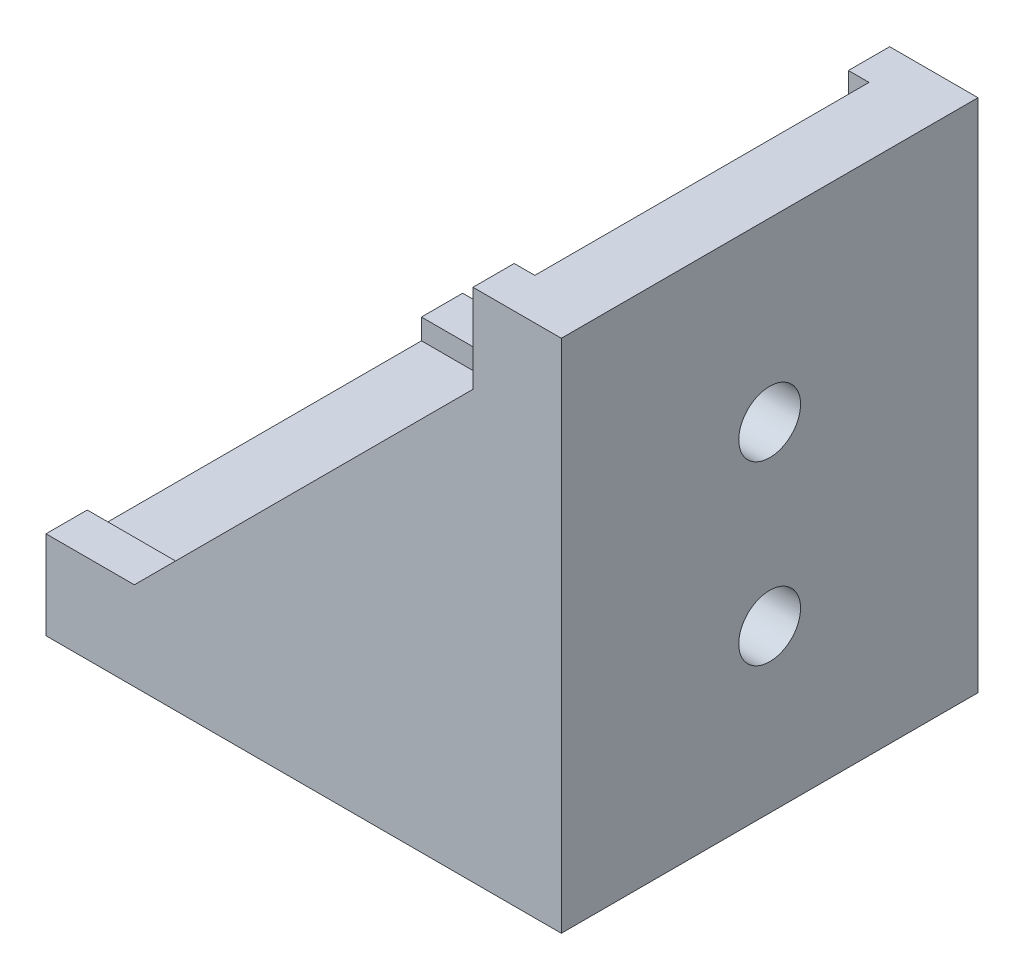
ISO-10303-21;
HEADER;
FILE_DESCRIPTION(('STEP AP214'),'2;1');
FILE_NAME('part.step','',(''),(''),'','','');
FILE_SCHEMA(('AUTOMOTIVE_DESIGN { 1 0 10303 214 1 1 1 1 }'));
ENDSEC;
DATA;
#1=APPLICATION_CONTEXT('core data for automotive mechanical design processes');
#2=APPLICATION_PROTOCOL_DEFINITION('international standard','automotive_design',2000,#1);
#3=PRODUCT_CONTEXT('',#1,'mechanical');
#4=PRODUCT('Part','Part','',(#3));
#5=PRODUCT_RELATED_PRODUCT_CATEGORY('part','',(#4));
#6=PRODUCT_DEFINITION_FORMATION('','',#4);
#7=PRODUCT_DEFINITION_CONTEXT('part definition',#1,'design');
#8=PRODUCT_DEFINITION('design','',#6,#7);
#9=PRODUCT_DEFINITION_SHAPE('','',#8);
#10=(LENGTH_UNIT() NAMED_UNIT(*) SI_UNIT(.MILLI.,.METRE.));
#11=(NAMED_UNIT(*) PLANE_ANGLE_UNIT() SI_UNIT($,.RADIAN.));
#12=(NAMED_UNIT(*) SI_UNIT($,.STERADIAN.) SOLID_ANGLE_UNIT());
#13=UNCERTAINTY_MEASURE_WITH_UNIT(LENGTH_MEASURE(1.E-05),#10,'distance_accuracy_value','');
#14=(GEOMETRIC_REPRESENTATION_CONTEXT(3) GLOBAL_UNCERTAINTY_ASSIGNED_CONTEXT((#13)) GLOBAL_UNIT_ASSIGNED_CONTEXT((#10,
#11,#12)) REPRESENTATION_CONTEXT('',''));
#15=CARTESIAN_POINT('',(0.,0.,0.));
#16=DIRECTION('',(0.,0.,1.));
#17=DIRECTION('',(1.,0.,0.));
#18=AXIS2_PLACEMENT_3D('',#15,#16,#17);
#19=CARTESIAN_POINT('',(29.,35.,14.15));
#20=DIRECTION('',(1.,0.,0.));
#21=DIRECTION('',(0.,0.,-1.));
#22=AXIS2_PLACEMENT_3D('',#19,#20,#21);
#23=PLANE('',#22);
#24=DIRECTION('',(0.,-1.,0.));
#25=VECTOR('',#24,1.);
#26=CARTESIAN_POINT('',(29.,35.,-11.35));
#27=LINE('',#26,#25);
#28=CARTESIAN_POINT('',(29.,35.,-11.35));
#29=VERTEX_POINT('',#28);
#30=CARTESIAN_POINT('',(29.,29.,-11.35));
#31=VERTEX_POINT('',#30);
#32=EDGE_CURVE('E222',#29,#31,#27,.T.);
#33=ORIENTED_EDGE('',*,*,#32,.F.);
#34=DIRECTION('',(0.,0.,-1.));
#35=VECTOR('',#34,1.);
#36=CARTESIAN_POINT('',(29.,35.,14.15));
#37=LINE('',#36,#35);
#38=CARTESIAN_POINT('',(29.,35.,-14.15));
#39=VERTEX_POINT('',#38);
#40=EDGE_CURVE('E131',#29,#39,#37,.T.);
#41=ORIENTED_EDGE('',*,*,#40,.T.);
#42=DIRECTION('',(0.,-1.,0.));
#43=VECTOR('',#42,1.);
#44=CARTESIAN_POINT('',(29.,35.,-14.15));
#45=LINE('',#44,#43);
#46=CARTESIAN_POINT('',(29.,29.,-14.15));
#47=VERTEX_POINT('',#46);
#48=EDGE_CURVE('E150',#39,#47,#45,.T.);
#49=ORIENTED_EDGE('',*,*,#48,.T.);
#50=DIRECTION('',(0.,0.,-1.));
#51=VECTOR('',#50,1.);
#52=CARTESIAN_POINT('',(29.,29.,14.15));
#53=LINE('',#52,#51);
#54=EDGE_CURVE('E132',#31,#47,#53,.T.);
#55=ORIENTED_EDGE('',*,*,#54,.F.);
#56=EDGE_LOOP('',(#33,#41,#49,#55));
#57=FACE_BOUND('',#56,.T.);
#58=ADVANCED_FACE('F35',(#57),#23,.F.);
#59=CARTESIAN_POINT('',(29.,29.,14.15));
#60=DIRECTION('',(0.707106781186547,-0.707106781186547,0.));
#61=DIRECTION('',(0.707106781186548,0.707106781186548,0.));
#62=AXIS2_PLACEMENT_3D('',#59,#60,#61);
#63=PLANE('',#62);
#64=DIRECTION('',(-0.707106781186548,-0.707106781186548,0.));
#65=VECTOR('',#64,1.);
#66=CARTESIAN_POINT('',(29.,29.,-11.35));
#67=LINE('',#66,#65);
#68=CARTESIAN_POINT('',(6.,6.,-11.35));
#69=VERTEX_POINT('',#68);
#70=EDGE_CURVE('E50',#31,#69,#67,.T.);
#71=ORIENTED_EDGE('',*,*,#70,.F.);
#72=ORIENTED_EDGE('',*,*,#54,.T.);
#73=DIRECTION('',(-0.707106781186548,-0.707106781186548,0.));
#74=VECTOR('',#73,1.);
#75=CARTESIAN_POINT('',(29.,29.,-14.15));
#76=LINE('',#75,#74);
#77=CARTESIAN_POINT('',(6.,6.,-14.15));
#78=VERTEX_POINT('',#77);
#79=EDGE_CURVE('E153',#47,#78,#76,.T.);
#80=ORIENTED_EDGE('',*,*,#79,.T.);
#81=DIRECTION('',(0.,0.,-1.));
#82=VECTOR('',#81,1.);
#83=CARTESIAN_POINT('',(6.,6.,14.15));
#84=LINE('',#83,#82);
#85=EDGE_CURVE('E162',#69,#78,#84,.T.);
#86=ORIENTED_EDGE('',*,*,#85,.F.);
#87=EDGE_LOOP('',(#71,#72,#80,#86));
#88=FACE_BOUND('',#87,.T.);
#89=ADVANCED_FACE('F327',(#88),#63,.F.);
#90=CARTESIAN_POINT('',(6.,6.,14.15));
#91=DIRECTION('',(0.,-1.,0.));
#92=DIRECTION('',(1.,0.,0.));
#93=AXIS2_PLACEMENT_3D('',#90,#91,#92);
#94=PLANE('',#93);
#95=DIRECTION('',(-1.,0.,0.));
#96=VECTOR('',#95,1.);
#97=CARTESIAN_POINT('',(6.,6.,-11.35));
#98=LINE('',#97,#96);
#99=CARTESIAN_POINT('',(0.,6.,-11.35));
#100=VERTEX_POINT('',#99);
#101=EDGE_CURVE('E43',#69,#100,#98,.T.);
#102=ORIENTED_EDGE('',*,*,#101,.F.);
#103=ORIENTED_EDGE('',*,*,#85,.T.);
#104=DIRECTION('',(-1.,0.,0.));
#105=VECTOR('',#104,1.);
#106=CARTESIAN_POINT('',(6.,6.,-14.15));
#107=LINE('',#106,#105);
#108=CARTESIAN_POINT('',(0.,6.,-14.15));
#109=VERTEX_POINT('',#108);
#110=EDGE_CURVE('E156',#78,#109,#107,.T.);
#111=ORIENTED_EDGE('',*,*,#110,.T.);
#112=DIRECTION('',(0.,0.,-1.));
#113=VECTOR('',#112,1.);
#114=CARTESIAN_POINT('',(0.,6.,14.15));
#115=LINE('',#114,#113);
#116=EDGE_CURVE('E90',#100,#109,#115,.T.);
#117=ORIENTED_EDGE('',*,*,#116,.F.);
#118=EDGE_LOOP('',(#102,#103,#111,#117));
#119=FACE_BOUND('',#118,.T.);
#120=ADVANCED_FACE('F192',(#119),#94,.F.);
#121=CARTESIAN_POINT('',(0.,6.,14.15));
#122=DIRECTION('',(1.,0.,0.));
#123=DIRECTION('',(0.,1.,0.));
#124=AXIS2_PLACEMENT_3D('',#121,#122,#123);
#125=PLANE('',#124);
#126=CARTESIAN_POINT('',(0.,6.,14.15));
#127=VERTEX_POINT('',#126);
#128=CARTESIAN_POINT('',(0.,6.,11.35));
#129=VERTEX_POINT('',#128);
#130=EDGE_CURVE('E159',#127,#129,#115,.T.);
#131=ORIENTED_EDGE('',*,*,#130,.T.);
#132=DIRECTION('',(0.,-1.,0.));
#133=VECTOR('',#132,1.);
#134=CARTESIAN_POINT('',(0.,35.,11.35));
#135=LINE('',#134,#133);
#136=CARTESIAN_POINT('',(0.,4.59999999999999,11.35));
#137=VERTEX_POINT('',#136);
#138=EDGE_CURVE('E236',#129,#137,#135,.T.);
#139=ORIENTED_EDGE('',*,*,#138,.T.);
#140=DIRECTION('',(0.,0.,-1.));
#141=VECTOR('',#140,1.);
#142=CARTESIAN_POINT('',(0.,4.59999999999999,11.35));
#143=LINE('',#142,#141);
#144=CARTESIAN_POINT('',(0.,4.59999999999999,-11.35));
#145=VERTEX_POINT('',#144);
#146=EDGE_CURVE('E188',#137,#145,#143,.T.);
#147=ORIENTED_EDGE('',*,*,#146,.T.);
#148=DIRECTION('',(0.,-1.,0.));
#149=VECTOR('',#148,1.);
#150=CARTESIAN_POINT('',(0.,35.,-11.35));
#151=LINE('',#150,#149);
#152=EDGE_CURVE('E178',#100,#145,#151,.T.);
#153=ORIENTED_EDGE('',*,*,#152,.F.);
#154=ORIENTED_EDGE('',*,*,#116,.T.);
#155=DIRECTION('',(0.,-1.,0.));
#156=VECTOR('',#155,1.);
#157=CARTESIAN_POINT('',(0.,6.,-14.15));
#158=LINE('',#157,#156);
#159=CARTESIAN_POINT('',(0.,0.,-14.15));
#160=VERTEX_POINT('',#159);
#161=EDGE_CURVE('E141',#109,#160,#158,.T.);
#162=ORIENTED_EDGE('',*,*,#161,.T.);
#163=DIRECTION('',(0.,0.,-1.));
#164=VECTOR('',#163,1.);
#165=CARTESIAN_POINT('',(0.,0.,14.15));
#166=LINE('',#165,#164);
#167=CARTESIAN_POINT('',(0.,0.,14.15));
#168=VERTEX_POINT('',#167);
#169=EDGE_CURVE('E172',#168,#160,#166,.T.);
#170=ORIENTED_EDGE('',*,*,#169,.F.);
#171=DIRECTION('',(0.,-1.,0.));
#172=VECTOR('',#171,1.);
#173=CARTESIAN_POINT('',(0.,6.,14.15));
#174=LINE('',#173,#172);
#175=EDGE_CURVE('E158',#127,#168,#174,.T.);
#176=ORIENTED_EDGE('',*,*,#175,.F.);
#177=EDGE_LOOP('',(#131,#139,#147,#153,#154,#162,#170,#176));
#178=FACE_BOUND('',#177,.T.);
#179=ADVANCED_FACE('F37',(#178),#125,.F.);
#180=CARTESIAN_POINT('',(0.,0.,14.15));
#181=DIRECTION('',(0.,1.,0.));
#182=DIRECTION('',(0.,0.,1.));
#183=AXIS2_PLACEMENT_3D('',#180,#181,#182);
#184=PLANE('',#183);
#185=CARTESIAN_POINT('',(20.85,0.,0.));
#186=DIRECTION('',(0.,1.,0.));
#187=DIRECTION('',(0.,0.,1.));
#188=AXIS2_PLACEMENT_3D('',#185,#186,#187);
#189=CIRCLE('',#188,2.55);
#190=CARTESIAN_POINT('',(20.85,0.,2.55));
#191=VERTEX_POINT('',#190);
#192=EDGE_CURVE('E252',#191,#191,#189,.T.);
#193=ORIENTED_EDGE('',*,*,#192,.T.);
#194=EDGE_LOOP('',(#193));
#195=FACE_BOUND('',#194,.T.);
#196=CARTESIAN_POINT('',(11.,0.,0.));
#197=DIRECTION('',(0.,1.,0.));
#198=DIRECTION('',(0.,0.,1.));
#199=AXIS2_PLACEMENT_3D('',#196,#197,#198);
#200=CIRCLE('',#199,2.55);
#201=CARTESIAN_POINT('',(11.,0.,2.55));
#202=VERTEX_POINT('',#201);
#203=EDGE_CURVE('E253',#202,#202,#200,.T.);
#204=ORIENTED_EDGE('',*,*,#203,.T.);
#205=EDGE_LOOP('',(#204));
#206=FACE_BOUND('',#205,.T.);
#207=DIRECTION('',(1.,0.,0.));
#208=VECTOR('',#207,1.);
#209=CARTESIAN_POINT('',(0.,0.,-14.15));
#210=LINE('',#209,#208);
#211=CARTESIAN_POINT('',(35.,0.,-14.15));
#212=VERTEX_POINT('',#211);
#213=EDGE_CURVE('E143',#160,#212,#210,.T.);
#214=ORIENTED_EDGE('',*,*,#213,.T.);
#215=DIRECTION('',(0.,0.,-1.));
#216=VECTOR('',#215,1.);
#217=CARTESIAN_POINT('',(35.,0.,14.15));
#218=LINE('',#217,#216);
#219=CARTESIAN_POINT('',(35.,0.,14.15));
#220=VERTEX_POINT('',#219);
#221=EDGE_CURVE('E169',#220,#212,#218,.T.);
#222=ORIENTED_EDGE('',*,*,#221,.F.);
#223=DIRECTION('',(1.,0.,0.));
#224=VECTOR('',#223,1.);
#225=CARTESIAN_POINT('',(0.,0.,14.15));
#226=LINE('',#225,#224);
#227=EDGE_CURVE('E99',#168,#220,#226,.T.);
#228=ORIENTED_EDGE('',*,*,#227,.F.);
#229=ORIENTED_EDGE('',*,*,#169,.T.);
#230=EDGE_LOOP('',(#214,#222,#228,#229));
#231=FACE_BOUND('',#230,.T.);
#232=ADVANCED_FACE('F201',(#195,#206,#231),#184,.F.);
#233=CARTESIAN_POINT('',(35.,0.,14.15));
#234=DIRECTION('',(-1.,0.,0.));
#235=DIRECTION('',(0.,0.,1.));
#236=AXIS2_PLACEMENT_3D('',#233,#234,#235);
#237=PLANE('',#236);
#238=CARTESIAN_POINT('',(35.,23.,0.));
#239=DIRECTION('',(-1.,0.,0.));
#240=DIRECTION('',(0.,0.,1.));
#241=AXIS2_PLACEMENT_3D('',#238,#239,#240);
#242=CIRCLE('',#241,2.1);
#243=CARTESIAN_POINT('',(35.,23.,2.1));
#244=VERTEX_POINT('',#243);
#245=EDGE_CURVE('E267',#244,#244,#242,.T.);
#246=ORIENTED_EDGE('',*,*,#245,.T.);
#247=EDGE_LOOP('',(#246));
#248=FACE_BOUND('',#247,.T.);
#249=CARTESIAN_POINT('',(35.,11.,0.));
#250=DIRECTION('',(-1.,0.,0.));
#251=DIRECTION('',(0.,0.,1.));
#252=AXIS2_PLACEMENT_3D('',#249,#250,#251);
#253=CIRCLE('',#252,2.1);
#254=CARTESIAN_POINT('',(35.,11.,2.1));
#255=VERTEX_POINT('',#254);
#256=EDGE_CURVE('E261',#255,#255,#253,.T.);
#257=ORIENTED_EDGE('',*,*,#256,.T.);
#258=EDGE_LOOP('',(#257));
#259=FACE_BOUND('',#258,.T.);
#260=DIRECTION('',(0.,1.,0.));
#261=VECTOR('',#260,1.);
#262=CARTESIAN_POINT('',(35.,0.,-14.15));
#263=LINE('',#262,#261);
#264=CARTESIAN_POINT('',(35.,35.,-14.15));
#265=VERTEX_POINT('',#264);
#266=EDGE_CURVE('E145',#212,#265,#263,.T.);
#267=ORIENTED_EDGE('',*,*,#266,.T.);
#268=DIRECTION('',(0.,0.,-1.));
#269=VECTOR('',#268,1.);
#270=CARTESIAN_POINT('',(35.,35.,14.15));
#271=LINE('',#270,#269);
#272=CARTESIAN_POINT('',(35.,35.,14.15));
#273=VERTEX_POINT('',#272);
#274=EDGE_CURVE('E166',#273,#265,#271,.T.);
#275=ORIENTED_EDGE('',*,*,#274,.F.);
#276=DIRECTION('',(0.,1.,0.));
#277=VECTOR('',#276,1.);
#278=CARTESIAN_POINT('',(35.,0.,14.15));
#279=LINE('',#278,#277);
#280=EDGE_CURVE('E206',#220,#273,#279,.T.);
#281=ORIENTED_EDGE('',*,*,#280,.F.);
#282=ORIENTED_EDGE('',*,*,#221,.T.);
#283=EDGE_LOOP('',(#267,#275,#281,#282));
#284=FACE_BOUND('',#283,.T.);
#285=ADVANCED_FACE('F204',(#248,#259,#284),#237,.F.);
#286=CARTESIAN_POINT('',(35.,35.,14.15));
#287=DIRECTION('',(0.,-1.,0.));
#288=DIRECTION('',(0.,0.,-1.));
#289=AXIS2_PLACEMENT_3D('',#286,#287,#288);
#290=PLANE('',#289);
#291=DIRECTION('',(0.,0.,-1.));
#292=VECTOR('',#291,1.);
#293=CARTESIAN_POINT('',(30.4,35.,11.35));
#294=LINE('',#293,#292);
#295=CARTESIAN_POINT('',(30.4,35.,11.35));
#296=VERTEX_POINT('',#295);
#297=CARTESIAN_POINT('',(30.4,35.,-11.35));
#298=VERTEX_POINT('',#297);
#299=EDGE_CURVE('E229',#296,#298,#294,.T.);
#300=ORIENTED_EDGE('',*,*,#299,.F.);
#301=DIRECTION('',(-1.,0.,0.));
#302=VECTOR('',#301,1.);
#303=CARTESIAN_POINT('',(30.4,35.,11.35));
#304=LINE('',#303,#302);
#305=CARTESIAN_POINT('',(29.,35.,11.35));
#306=VERTEX_POINT('',#305);
#307=EDGE_CURVE('E232',#296,#306,#304,.T.);
#308=ORIENTED_EDGE('',*,*,#307,.T.);
#309=CARTESIAN_POINT('',(29.,35.,14.15));
#310=VERTEX_POINT('',#309);
#311=EDGE_CURVE('E164',#310,#306,#37,.T.);
#312=ORIENTED_EDGE('',*,*,#311,.F.);
#313=DIRECTION('',(-1.,0.,0.));
#314=VECTOR('',#313,1.);
#315=CARTESIAN_POINT('',(35.,35.,14.15));
#316=LINE('',#315,#314);
#317=EDGE_CURVE('E118',#273,#310,#316,.T.);
#318=ORIENTED_EDGE('',*,*,#317,.F.);
#319=ORIENTED_EDGE('',*,*,#274,.T.);
#320=DIRECTION('',(-1.,0.,0.));
#321=VECTOR('',#320,1.);
#322=CARTESIAN_POINT('',(35.,35.,-14.15));
#323=LINE('',#322,#321);
#324=EDGE_CURVE('E147',#265,#39,#323,.T.);
#325=ORIENTED_EDGE('',*,*,#324,.T.);
#326=ORIENTED_EDGE('',*,*,#40,.F.);
#327=DIRECTION('',(-1.,0.,0.));
#328=VECTOR('',#327,1.);
#329=CARTESIAN_POINT('',(30.4,35.,-11.35));
#330=LINE('',#329,#328);
#331=EDGE_CURVE('E233',#298,#29,#330,.T.);
#332=ORIENTED_EDGE('',*,*,#331,.F.);
#333=EDGE_LOOP('',(#300,#308,#312,#318,#319,#325,#326,#332));
#334=FACE_BOUND('',#333,.T.);
#335=ADVANCED_FACE('F212',(#334),#290,.F.);
#336=ORIENTED_EDGE('',*,*,#311,.T.);
#337=DIRECTION('',(0.,-1.,0.));
#338=VECTOR('',#337,1.);
#339=CARTESIAN_POINT('',(29.,35.,11.35));
#340=LINE('',#339,#338);
#341=CARTESIAN_POINT('',(29.,29.,11.35));
#342=VERTEX_POINT('',#341);
#343=EDGE_CURVE('E128',#306,#342,#340,.T.);
#344=ORIENTED_EDGE('',*,*,#343,.T.);
#345=CARTESIAN_POINT('',(29.,29.,14.15));
#346=VERTEX_POINT('',#345);
#347=EDGE_CURVE('E125',#346,#342,#53,.T.);
#348=ORIENTED_EDGE('',*,*,#347,.F.);
#349=DIRECTION('',(0.,-1.,0.));
#350=VECTOR('',#349,1.);
#351=CARTESIAN_POINT('',(29.,35.,14.15));
#352=LINE('',#351,#350);
#353=EDGE_CURVE('E111',#310,#346,#352,.T.);
#354=ORIENTED_EDGE('',*,*,#353,.F.);
#355=EDGE_LOOP('',(#336,#344,#348,#354));
#356=FACE_BOUND('',#355,.T.);
#357=ADVANCED_FACE('F126',(#356),#23,.F.);
#358=ORIENTED_EDGE('',*,*,#347,.T.);
#359=DIRECTION('',(-0.707106781186548,-0.707106781186548,0.));
#360=VECTOR('',#359,1.);
#361=CARTESIAN_POINT('',(29.,29.,11.35));
#362=LINE('',#361,#360);
#363=CARTESIAN_POINT('',(6.,6.,11.35));
#364=VERTEX_POINT('',#363);
#365=EDGE_CURVE('E220',#342,#364,#362,.T.);
#366=ORIENTED_EDGE('',*,*,#365,.T.);
#367=CARTESIAN_POINT('',(6.,6.,14.15));
#368=VERTEX_POINT('',#367);
#369=EDGE_CURVE('E136',#368,#364,#84,.T.);
#370=ORIENTED_EDGE('',*,*,#369,.F.);
#371=DIRECTION('',(-0.707106781186548,-0.707106781186548,0.));
#372=VECTOR('',#371,1.);
#373=CARTESIAN_POINT('',(29.,29.,14.15));
#374=LINE('',#373,#372);
#375=EDGE_CURVE('E115',#346,#368,#374,.T.);
#376=ORIENTED_EDGE('',*,*,#375,.F.);
#377=EDGE_LOOP('',(#358,#366,#370,#376));
#378=FACE_BOUND('',#377,.T.);
#379=ADVANCED_FACE('F134',(#378),#63,.F.);
#380=ORIENTED_EDGE('',*,*,#369,.T.);
#381=DIRECTION('',(-1.,0.,0.));
#382=VECTOR('',#381,1.);
#383=CARTESIAN_POINT('',(6.,6.,11.35));
#384=LINE('',#383,#382);
#385=EDGE_CURVE('E11',#364,#129,#384,.T.);
#386=ORIENTED_EDGE('',*,*,#385,.T.);
#387=ORIENTED_EDGE('',*,*,#130,.F.);
#388=DIRECTION('',(-1.,0.,0.));
#389=VECTOR('',#388,1.);
#390=CARTESIAN_POINT('',(6.,6.,14.15));
#391=LINE('',#390,#389);
#392=EDGE_CURVE('E59',#368,#127,#391,.T.);
#393=ORIENTED_EDGE('',*,*,#392,.F.);
#394=EDGE_LOOP('',(#380,#386,#387,#393));
#395=FACE_BOUND('',#394,.T.);
#396=ADVANCED_FACE('F312',(#395),#94,.F.);
#397=CARTESIAN_POINT('',(0.,0.,14.15));
#398=DIRECTION('',(0.,0.,1.));
#399=DIRECTION('',(1.,0.,0.));
#400=AXIS2_PLACEMENT_3D('',#397,#398,#399);
#401=PLANE('',#400);
#402=ORIENTED_EDGE('',*,*,#175,.T.);
#403=ORIENTED_EDGE('',*,*,#227,.T.);
#404=ORIENTED_EDGE('',*,*,#280,.T.);
#405=ORIENTED_EDGE('',*,*,#317,.T.);
#406=ORIENTED_EDGE('',*,*,#353,.T.);
#407=ORIENTED_EDGE('',*,*,#375,.T.);
#408=ORIENTED_EDGE('',*,*,#392,.T.);
#409=EDGE_LOOP('',(#402,#403,#404,#405,#406,#407,#408));
#410=FACE_BOUND('',#409,.T.);
#411=ADVANCED_FACE('F113',(#410),#401,.T.);
#412=CARTESIAN_POINT('',(0.,0.,-14.15));
#413=DIRECTION('',(0.,0.,1.));
#414=DIRECTION('',(1.,0.,0.));
#415=AXIS2_PLACEMENT_3D('',#412,#413,#414);
#416=PLANE('',#415);
#417=ORIENTED_EDGE('',*,*,#161,.F.);
#418=ORIENTED_EDGE('',*,*,#110,.F.);
#419=ORIENTED_EDGE('',*,*,#79,.F.);
#420=ORIENTED_EDGE('',*,*,#48,.F.);
#421=ORIENTED_EDGE('',*,*,#324,.F.);
#422=ORIENTED_EDGE('',*,*,#266,.F.);
#423=ORIENTED_EDGE('',*,*,#213,.F.);
#424=EDGE_LOOP('',(#417,#418,#419,#420,#421,#422,#423));
#425=FACE_BOUND('',#424,.T.);
#426=ADVANCED_FACE('F197',(#425),#416,.F.);
#427=CARTESIAN_POINT('',(0.,0.,11.35));
#428=DIRECTION('',(0.,0.,1.));
#429=DIRECTION('',(1.,0.,0.));
#430=AXIS2_PLACEMENT_3D('',#427,#428,#429);
#431=PLANE('',#430);
#432=ORIENTED_EDGE('',*,*,#307,.F.);
#433=DIRECTION('',(0.,1.,0.));
#434=VECTOR('',#433,1.);
#435=CARTESIAN_POINT('',(30.4,4.59999999999999,11.35));
#436=LINE('',#435,#434);
#437=CARTESIAN_POINT('',(30.4,4.59999999999999,11.35));
#438=VERTEX_POINT('',#437);
#439=EDGE_CURVE('E242',#438,#296,#436,.T.);
#440=ORIENTED_EDGE('',*,*,#439,.F.);
#441=DIRECTION('',(1.,0.,0.));
#442=VECTOR('',#441,1.);
#443=CARTESIAN_POINT('',(0.,4.59999999999999,11.35));
#444=LINE('',#443,#442);
#445=EDGE_CURVE('E245',#137,#438,#444,.T.);
#446=ORIENTED_EDGE('',*,*,#445,.F.);
#447=ORIENTED_EDGE('',*,*,#138,.F.);
#448=ORIENTED_EDGE('',*,*,#385,.F.);
#449=ORIENTED_EDGE('',*,*,#365,.F.);
#450=ORIENTED_EDGE('',*,*,#343,.F.);
#451=EDGE_LOOP('',(#432,#440,#446,#447,#448,#449,#450));
#452=FACE_BOUND('',#451,.T.);
#453=ADVANCED_FACE('F310',(#452),#431,.F.);
#454=CARTESIAN_POINT('',(0.,0.,-11.35));
#455=DIRECTION('',(0.,0.,1.));
#456=DIRECTION('',(1.,0.,0.));
#457=AXIS2_PLACEMENT_3D('',#454,#455,#456);
#458=PLANE('',#457);
#459=ORIENTED_EDGE('',*,*,#32,.T.);
#460=ORIENTED_EDGE('',*,*,#70,.T.);
#461=ORIENTED_EDGE('',*,*,#101,.T.);
#462=ORIENTED_EDGE('',*,*,#152,.T.);
#463=DIRECTION('',(1.,0.,0.));
#464=VECTOR('',#463,1.);
#465=CARTESIAN_POINT('',(0.,4.59999999999999,-11.35));
#466=LINE('',#465,#464);
#467=CARTESIAN_POINT('',(30.4,4.59999999999999,-11.35));
#468=VERTEX_POINT('',#467);
#469=EDGE_CURVE('E189',#145,#468,#466,.T.);
#470=ORIENTED_EDGE('',*,*,#469,.T.);
#471=DIRECTION('',(0.,1.,0.));
#472=VECTOR('',#471,1.);
#473=CARTESIAN_POINT('',(30.4,4.59999999999999,-11.35));
#474=LINE('',#473,#472);
#475=EDGE_CURVE('E237',#468,#298,#474,.T.);
#476=ORIENTED_EDGE('',*,*,#475,.T.);
#477=ORIENTED_EDGE('',*,*,#331,.T.);
#478=EDGE_LOOP('',(#459,#460,#461,#462,#470,#476,#477));
#479=FACE_BOUND('',#478,.T.);
#480=ADVANCED_FACE('F175',(#479),#458,.T.);
#481=CARTESIAN_POINT('',(0.,4.59999999999999,11.35));
#482=DIRECTION('',(0.,1.,0.));
#483=DIRECTION('',(0.,0.,1.));
#484=AXIS2_PLACEMENT_3D('',#481,#482,#483);
#485=PLANE('',#484);
#486=CARTESIAN_POINT('',(20.85,4.59999999999999,0.));
#487=DIRECTION('',(0.,1.,0.));
#488=DIRECTION('',(0.,0.,1.));
#489=AXIS2_PLACEMENT_3D('',#486,#487,#488);
#490=CIRCLE('',#489,2.55);
#491=CARTESIAN_POINT('',(20.85,4.59999999999999,2.55));
#492=VERTEX_POINT('',#491);
#493=EDGE_CURVE('E190',#492,#492,#490,.T.);
#494=ORIENTED_EDGE('',*,*,#493,.F.);
#495=EDGE_LOOP('',(#494));
#496=FACE_BOUND('',#495,.T.);
#497=CARTESIAN_POINT('',(11.,4.59999999999999,0.));
#498=DIRECTION('',(0.,1.,0.));
#499=DIRECTION('',(0.,0.,1.));
#500=AXIS2_PLACEMENT_3D('',#497,#498,#499);
#501=CIRCLE('',#500,2.55);
#502=CARTESIAN_POINT('',(11.,4.59999999999999,2.55));
#503=VERTEX_POINT('',#502);
#504=EDGE_CURVE('E249',#503,#503,#501,.T.);
#505=ORIENTED_EDGE('',*,*,#504,.F.);
#506=EDGE_LOOP('',(#505));
#507=FACE_BOUND('',#506,.T.);
#508=ORIENTED_EDGE('',*,*,#469,.F.);
#509=ORIENTED_EDGE('',*,*,#146,.F.);
#510=ORIENTED_EDGE('',*,*,#445,.T.);
#511=DIRECTION('',(0.,0.,-1.));
#512=VECTOR('',#511,1.);
#513=CARTESIAN_POINT('',(30.4,4.59999999999999,11.35));
#514=LINE('',#513,#512);
#515=EDGE_CURVE('E226',#438,#468,#514,.T.);
#516=ORIENTED_EDGE('',*,*,#515,.T.);
#517=EDGE_LOOP('',(#508,#509,#510,#516));
#518=FACE_BOUND('',#517,.T.);
#519=ADVANCED_FACE('F280',(#496,#507,#518),#485,.T.);
#520=CARTESIAN_POINT('',(30.4,4.59999999999999,11.35));
#521=DIRECTION('',(-1.,0.,0.));
#522=DIRECTION('',(0.,0.,1.));
#523=AXIS2_PLACEMENT_3D('',#520,#521,#522);
#524=PLANE('',#523);
#525=CARTESIAN_POINT('',(30.4,23.,0.));
#526=DIRECTION('',(-1.,0.,0.));
#527=DIRECTION('',(0.,0.,1.));
#528=AXIS2_PLACEMENT_3D('',#525,#526,#527);
#529=CIRCLE('',#528,2.1);
#530=CARTESIAN_POINT('',(30.4,23.,2.1));
#531=VERTEX_POINT('',#530);
#532=EDGE_CURVE('E256',#531,#531,#529,.T.);
#533=ORIENTED_EDGE('',*,*,#532,.F.);
#534=EDGE_LOOP('',(#533));
#535=FACE_BOUND('',#534,.T.);
#536=CARTESIAN_POINT('',(30.4,11.,0.));
#537=DIRECTION('',(-1.,0.,0.));
#538=DIRECTION('',(0.,0.,1.));
#539=AXIS2_PLACEMENT_3D('',#536,#537,#538);
#540=CIRCLE('',#539,2.1);
#541=CARTESIAN_POINT('',(30.4,11.,2.1));
#542=VERTEX_POINT('',#541);
#543=EDGE_CURVE('E264',#542,#542,#540,.T.);
#544=ORIENTED_EDGE('',*,*,#543,.F.);
#545=EDGE_LOOP('',(#544));
#546=FACE_BOUND('',#545,.T.);
#547=ORIENTED_EDGE('',*,*,#475,.F.);
#548=ORIENTED_EDGE('',*,*,#515,.F.);
#549=ORIENTED_EDGE('',*,*,#439,.T.);
#550=ORIENTED_EDGE('',*,*,#299,.T.);
#551=EDGE_LOOP('',(#547,#548,#549,#550));
#552=FACE_BOUND('',#551,.T.);
#553=ADVANCED_FACE('F276',(#535,#546,#552),#524,.T.);
#554=CARTESIAN_POINT('',(11.,35.001,0.));
#555=DIRECTION('',(0.,-1.,0.));
#556=DIRECTION('',(0.,0.,-1.));
#557=AXIS2_PLACEMENT_3D('',#554,#555,#556);
#558=CYLINDRICAL_SURFACE('',#557,2.55);
#559=ORIENTED_EDGE('',*,*,#504,.T.);
#560=EDGE_LOOP('',(#559));
#561=FACE_BOUND('',#560,.T.);
#562=ORIENTED_EDGE('',*,*,#203,.F.);
#563=EDGE_LOOP('',(#562));
#564=FACE_BOUND('',#563,.T.);
#565=ADVANCED_FACE('F279',(#561,#564),#558,.F.);
#566=CARTESIAN_POINT('',(20.85,35.001,0.));
#567=DIRECTION('',(0.,-1.,0.));
#568=DIRECTION('',(0.,0.,-1.));
#569=AXIS2_PLACEMENT_3D('',#566,#567,#568);
#570=CYLINDRICAL_SURFACE('',#569,2.55);
#571=ORIENTED_EDGE('',*,*,#493,.T.);
#572=EDGE_LOOP('',(#571));
#573=FACE_BOUND('',#572,.T.);
#574=ORIENTED_EDGE('',*,*,#192,.F.);
#575=EDGE_LOOP('',(#574));
#576=FACE_BOUND('',#575,.T.);
#577=ADVANCED_FACE('F356',(#573,#576),#570,.F.);
#578=CARTESIAN_POINT('',(35.001,11.,0.));
#579=DIRECTION('',(-1.,0.,0.));
#580=DIRECTION('',(0.,0.,1.));
#581=AXIS2_PLACEMENT_3D('',#578,#579,#580);
#582=CYLINDRICAL_SURFACE('',#581,2.1);
#583=ORIENTED_EDGE('',*,*,#543,.T.);
#584=EDGE_LOOP('',(#583));
#585=FACE_BOUND('',#584,.T.);
#586=ORIENTED_EDGE('',*,*,#256,.F.);
#587=EDGE_LOOP('',(#586));
#588=FACE_BOUND('',#587,.T.);
#589=ADVANCED_FACE('F362',(#585,#588),#582,.F.);
#590=CARTESIAN_POINT('',(35.001,23.,0.));
#591=DIRECTION('',(-1.,0.,0.));
#592=DIRECTION('',(0.,0.,1.));
#593=AXIS2_PLACEMENT_3D('',#590,#591,#592);
#594=CYLINDRICAL_SURFACE('',#593,2.1);
#595=ORIENTED_EDGE('',*,*,#532,.T.);
#596=EDGE_LOOP('',(#595));
#597=FACE_BOUND('',#596,.T.);
#598=ORIENTED_EDGE('',*,*,#245,.F.);
#599=EDGE_LOOP('',(#598));
#600=FACE_BOUND('',#599,.T.);
#601=ADVANCED_FACE('F273',(#597,#600),#594,.F.);
#602=CLOSED_SHELL('',(#58,#89,#120,#179,#232,#285,#335,#357,#379,#396,#411,#426,#453,#480,#519,
#553,#565,#577,#589,#601));
#603=MANIFOLD_SOLID_BREP('B2',#602);
#604=ADVANCED_BREP_SHAPE_REPRESENTATION('',(#18,#603),#14);
#605=SHAPE_DEFINITION_REPRESENTATION(#9,#604);
ENDSEC;
END-ISO-10303-21;
